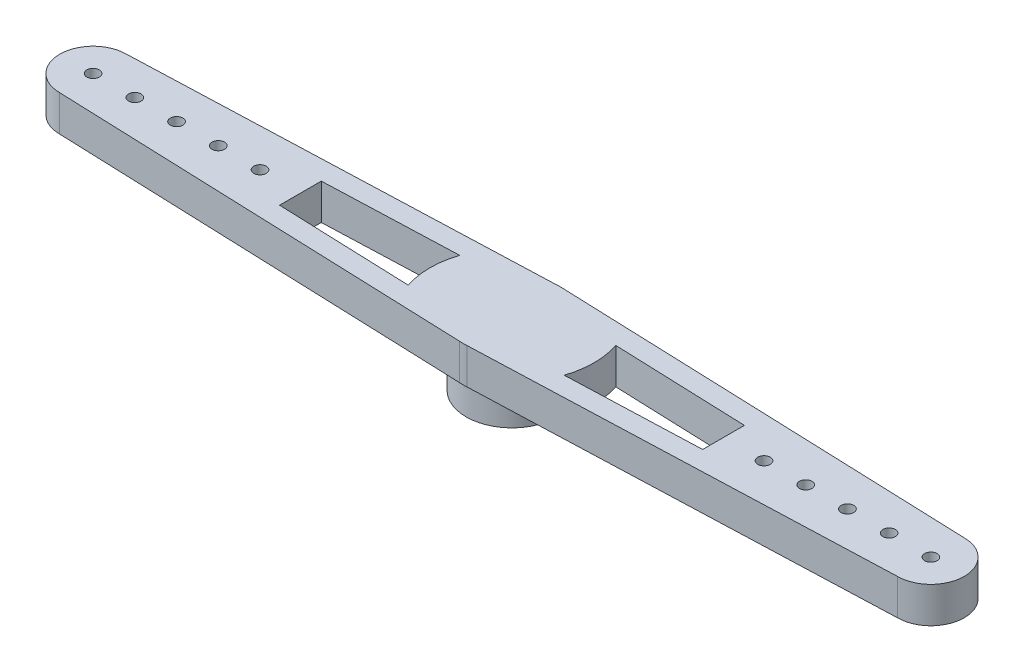
ISO-10303-21;
HEADER;
FILE_DESCRIPTION(('STEP AP214'),'2;1');
FILE_NAME('part.step','',(''),(''),'','','');
FILE_SCHEMA(('AUTOMOTIVE_DESIGN { 1 0 10303 214 1 1 1 1 }'));
ENDSEC;
DATA;
#1=APPLICATION_CONTEXT('core data for automotive mechanical design processes');
#2=APPLICATION_PROTOCOL_DEFINITION('international standard','automotive_design',2000,#1);
#3=PRODUCT_CONTEXT('',#1,'mechanical');
#4=PRODUCT('Part','Part','',(#3));
#5=PRODUCT_RELATED_PRODUCT_CATEGORY('part','',(#4));
#6=PRODUCT_DEFINITION_FORMATION('','',#4);
#7=PRODUCT_DEFINITION_CONTEXT('part definition',#1,'design');
#8=PRODUCT_DEFINITION('design','',#6,#7);
#9=PRODUCT_DEFINITION_SHAPE('','',#8);
#10=(LENGTH_UNIT() NAMED_UNIT(*) SI_UNIT(.MILLI.,.METRE.));
#11=(NAMED_UNIT(*) PLANE_ANGLE_UNIT() SI_UNIT($,.RADIAN.));
#12=(NAMED_UNIT(*) SI_UNIT($,.STERADIAN.) SOLID_ANGLE_UNIT());
#13=UNCERTAINTY_MEASURE_WITH_UNIT(LENGTH_MEASURE(1.E-05),#10,'distance_accuracy_value','');
#14=(GEOMETRIC_REPRESENTATION_CONTEXT(3) GLOBAL_UNCERTAINTY_ASSIGNED_CONTEXT((#13)) GLOBAL_UNIT_ASSIGNED_CONTEXT((#10,
#11,#12)) REPRESENTATION_CONTEXT('',''));
#15=CARTESIAN_POINT('',(0.,0.,0.));
#16=DIRECTION('',(0.,0.,1.));
#17=DIRECTION('',(1.,0.,0.));
#18=AXIS2_PLACEMENT_3D('',#15,#16,#17);
#19=CARTESIAN_POINT('',(0.,0.,0.));
#20=DIRECTION('',(0.,1.,0.));
#21=DIRECTION('',(0.,0.,1.));
#22=AXIS2_PLACEMENT_3D('',#19,#20,#21);
#23=PLANE('',#22);
#24=CARTESIAN_POINT('',(0.,0.,0.));
#25=DIRECTION('',(0.,1.,0.));
#26=DIRECTION('',(0.,0.,1.));
#27=AXIS2_PLACEMENT_3D('',#24,#25,#26);
#28=CIRCLE('',#27,1.95);
#29=CARTESIAN_POINT('',(0.,0.,1.95));
#30=VERTEX_POINT('',#29);
#31=EDGE_CURVE('E20',#30,#30,#28,.F.);
#32=ORIENTED_EDGE('',*,*,#31,.T.);
#33=EDGE_LOOP('',(#32));
#34=FACE_BOUND('',#33,.T.);
#35=ADVANCED_FACE('F17',(#34),#23,.F.);
#36=CARTESIAN_POINT('',(0.,-1.75,0.));
#37=DIRECTION('',(0.,1.,0.));
#38=DIRECTION('',(0.,0.,1.));
#39=AXIS2_PLACEMENT_3D('',#36,#37,#38);
#40=CYLINDRICAL_SURFACE('',#39,1.95);
#41=CARTESIAN_POINT('',(0.,-1.75,0.));
#42=DIRECTION('',(0.,1.,0.));
#43=DIRECTION('',(0.,0.,1.));
#44=AXIS2_PLACEMENT_3D('',#41,#42,#43);
#45=CIRCLE('',#44,1.95);
#46=CARTESIAN_POINT('',(0.,-1.75,1.95));
#47=VERTEX_POINT('',#46);
#48=EDGE_CURVE('E352',#47,#47,#45,.F.);
#49=ORIENTED_EDGE('',*,*,#48,.T.);
#50=EDGE_LOOP('',(#49));
#51=FACE_BOUND('',#50,.T.);
#52=ORIENTED_EDGE('',*,*,#31,.F.);
#53=EDGE_LOOP('',(#52));
#54=FACE_BOUND('',#53,.T.);
#55=ADVANCED_FACE('F360',(#51,#54),#40,.F.);
#56=CARTESIAN_POINT('',(0.,-1.75,0.));
#57=DIRECTION('',(0.,1.,0.));
#58=DIRECTION('',(0.,0.,1.));
#59=AXIS2_PLACEMENT_3D('',#56,#57,#58);
#60=PLANE('',#59);
#61=CARTESIAN_POINT('',(0.,-1.75,0.));
#62=DIRECTION('',(0.,1.,0.));
#63=DIRECTION('',(0.,0.,1.));
#64=AXIS2_PLACEMENT_3D('',#61,#62,#63);
#65=CIRCLE('',#64,2.75);
#66=CARTESIAN_POINT('',(0.,-1.75,2.75));
#67=VERTEX_POINT('',#66);
#68=EDGE_CURVE('E141',#67,#67,#65,.T.);
#69=ORIENTED_EDGE('',*,*,#68,.F.);
#70=EDGE_LOOP('',(#69));
#71=FACE_BOUND('',#70,.T.);
#72=ORIENTED_EDGE('',*,*,#48,.F.);
#73=EDGE_LOOP('',(#72));
#74=FACE_BOUND('',#73,.T.);
#75=ADVANCED_FACE('F362',(#71,#74),#60,.F.);
#76=CARTESIAN_POINT('',(0.,-1.75,0.));
#77=DIRECTION('',(0.,1.,0.));
#78=DIRECTION('',(0.,0.,1.));
#79=AXIS2_PLACEMENT_3D('',#76,#77,#78);
#80=CYLINDRICAL_SURFACE('',#79,2.75);
#81=CARTESIAN_POINT('',(0.,0.,0.));
#82=DIRECTION('',(0.,1.,0.));
#83=DIRECTION('',(0.,0.,1.));
#84=AXIS2_PLACEMENT_3D('',#81,#82,#83);
#85=CIRCLE('',#84,2.75);
#86=CARTESIAN_POINT('',(0.,0.,2.75));
#87=VERTEX_POINT('',#86);
#88=EDGE_CURVE('E347',#87,#87,#85,.F.);
#89=ORIENTED_EDGE('',*,*,#88,.T.);
#90=EDGE_LOOP('',(#89));
#91=FACE_BOUND('',#90,.T.);
#92=ORIENTED_EDGE('',*,*,#68,.T.);
#93=EDGE_LOOP('',(#92));
#94=FACE_BOUND('',#93,.T.);
#95=ADVANCED_FACE('F368',(#91,#94),#80,.T.);
#96=CARTESIAN_POINT('',(0.,2.15,0.));
#97=DIRECTION('',(0.,-1.,0.));
#98=DIRECTION('',(0.,0.,-1.));
#99=AXIS2_PLACEMENT_3D('',#96,#97,#98);
#100=CYLINDRICAL_SURFACE('',#99,2.925);
#101=CARTESIAN_POINT('',(0.,0.,0.));
#102=DIRECTION('',(0.,-1.,0.));
#103=DIRECTION('',(0.,0.,-1.));
#104=AXIS2_PLACEMENT_3D('',#101,#102,#103);
#105=CIRCLE('',#104,2.925);
#106=CARTESIAN_POINT('',(0.215295254040806,0.,-2.91706581235108));
#107=VERTEX_POINT('',#106);
#108=CARTESIAN_POINT('',(-0.215295254040806,0.,-2.91706581235108));
#109=VERTEX_POINT('',#108);
#110=EDGE_CURVE('E345',#107,#109,#105,.F.);
#111=ORIENTED_EDGE('',*,*,#110,.T.);
#112=DIRECTION('',(0.,1.,0.));
#113=VECTOR('',#112,1.);
#114=CARTESIAN_POINT('',(-0.215295254040813,2.15,-2.91706581235108));
#115=LINE('',#114,#113);
#116=CARTESIAN_POINT('',(-0.215295254040802,2.15,-2.91706581235109));
#117=VERTEX_POINT('',#116);
#118=EDGE_CURVE('E138',#109,#117,#115,.T.);
#119=ORIENTED_EDGE('',*,*,#118,.T.);
#120=CARTESIAN_POINT('',(0.,2.15,0.));
#121=DIRECTION('',(0.,-1.,0.));
#122=DIRECTION('',(0.,0.,-1.));
#123=AXIS2_PLACEMENT_3D('',#120,#121,#122);
#124=CIRCLE('',#123,2.925);
#125=CARTESIAN_POINT('',(0.215295254040806,2.15,-2.91706581235108));
#126=VERTEX_POINT('',#125);
#127=EDGE_CURVE('E129',#117,#126,#124,.T.);
#128=ORIENTED_EDGE('',*,*,#127,.T.);
#129=DIRECTION('',(0.,1.,0.));
#130=VECTOR('',#129,1.);
#131=CARTESIAN_POINT('',(0.215295254040813,2.15,-2.91706581235108));
#132=LINE('',#131,#130);
#133=EDGE_CURVE('E135',#126,#107,#132,.F.);
#134=ORIENTED_EDGE('',*,*,#133,.T.);
#135=EDGE_LOOP('',(#111,#119,#128,#134));
#136=FACE_BOUND('',#135,.T.);
#137=ADVANCED_FACE('F134',(#136),#100,.T.);
#138=CARTESIAN_POINT('',(0.,2.15,0.));
#139=DIRECTION('',(0.,-1.,0.));
#140=DIRECTION('',(0.,0.,-1.));
#141=AXIS2_PLACEMENT_3D('',#138,#139,#140);
#142=CYLINDRICAL_SURFACE('',#141,2.925);
#143=DIRECTION('',(0.,1.,0.));
#144=VECTOR('',#143,1.);
#145=CARTESIAN_POINT('',(-0.215295254040813,2.15,2.91706581235108));
#146=LINE('',#145,#144);
#147=CARTESIAN_POINT('',(-0.215295254040806,0.,2.91706581235108));
#148=VERTEX_POINT('',#147);
#149=CARTESIAN_POINT('',(-0.215295254040806,2.15,2.91706581235108));
#150=VERTEX_POINT('',#149);
#151=EDGE_CURVE('E214',#148,#150,#146,.T.);
#152=ORIENTED_EDGE('',*,*,#151,.F.);
#153=CARTESIAN_POINT('',(0.,0.,0.));
#154=DIRECTION('',(0.,-1.,0.));
#155=DIRECTION('',(0.,0.,-1.));
#156=AXIS2_PLACEMENT_3D('',#153,#154,#155);
#157=CIRCLE('',#156,2.925);
#158=CARTESIAN_POINT('',(0.215295254040806,0.,2.91706581235108));
#159=VERTEX_POINT('',#158);
#160=EDGE_CURVE('E343',#148,#159,#157,.F.);
#161=ORIENTED_EDGE('',*,*,#160,.T.);
#162=DIRECTION('',(0.,1.,0.));
#163=VECTOR('',#162,1.);
#164=CARTESIAN_POINT('',(0.215295254040813,2.15,2.91706581235108));
#165=LINE('',#164,#163);
#166=CARTESIAN_POINT('',(0.215295254040806,2.15,2.91706581235108));
#167=VERTEX_POINT('',#166);
#168=EDGE_CURVE('E207',#159,#167,#165,.T.);
#169=ORIENTED_EDGE('',*,*,#168,.T.);
#170=CARTESIAN_POINT('',(0.,2.15,0.));
#171=DIRECTION('',(0.,-1.,0.));
#172=DIRECTION('',(0.,0.,-1.));
#173=AXIS2_PLACEMENT_3D('',#170,#171,#172);
#174=CIRCLE('',#173,2.925);
#175=EDGE_CURVE('E140',#167,#150,#174,.T.);
#176=ORIENTED_EDGE('',*,*,#175,.T.);
#177=EDGE_LOOP('',(#152,#161,#169,#176));
#178=FACE_BOUND('',#177,.T.);
#179=ADVANCED_FACE('F475',(#178),#142,.T.);
#180=CARTESIAN_POINT('',(0.,0.,0.));
#181=DIRECTION('',(0.,1.,0.));
#182=DIRECTION('',(0.,0.,1.));
#183=AXIS2_PLACEMENT_3D('',#180,#181,#182);
#184=PLANE('',#183);
#185=DIRECTION('',(0.999321634213441,0.,-0.0368275901054752));
#186=VECTOR('',#185,1.);
#187=CARTESIAN_POINT('',(0.0631959614652687,0.,1.71483095435487));
#188=LINE('',#187,#186);
#189=CARTESIAN_POINT('',(4.67644672287854,0.,1.54482071713147));
#190=VERTEX_POINT('',#189);
#191=CARTESIAN_POINT('',(12.6764467228785,0.,1.25));
#192=VERTEX_POINT('',#191);
#193=EDGE_CURVE('E194',#190,#192,#188,.T.);
#194=ORIENTED_EDGE('',*,*,#193,.T.);
#195=DIRECTION('',(0.,0.,-1.));
#196=VECTOR('',#195,1.);
#197=CARTESIAN_POINT('',(12.6764467228785,0.,0.));
#198=LINE('',#197,#196);
#199=CARTESIAN_POINT('',(12.6764467228785,0.,-1.25));
#200=VERTEX_POINT('',#199);
#201=EDGE_CURVE('E188',#192,#200,#198,.T.);
#202=ORIENTED_EDGE('',*,*,#201,.T.);
#203=DIRECTION('',(0.999321634213441,0.,0.0368275901054754));
#204=VECTOR('',#203,1.);
#205=CARTESIAN_POINT('',(0.063195961465269,0.,-1.71483095435487));
#206=LINE('',#205,#204);
#207=CARTESIAN_POINT('',(4.67644672287854,0.,-1.54482071713147));
#208=VERTEX_POINT('',#207);
#209=EDGE_CURVE('E181',#208,#200,#206,.T.);
#210=ORIENTED_EDGE('',*,*,#209,.F.);
#211=CARTESIAN_POINT('',(0.,0.,0.));
#212=DIRECTION('',(0.,-1.,0.));
#213=DIRECTION('',(0.,0.,-1.));
#214=AXIS2_PLACEMENT_3D('',#211,#212,#213);
#215=CIRCLE('',#214,4.925);
#216=EDGE_CURVE('E182',#190,#208,#215,.F.);
#217=ORIENTED_EDGE('',*,*,#216,.F.);
#218=EDGE_LOOP('',(#194,#202,#210,#217));
#219=FACE_BOUND('',#218,.T.);
#220=CARTESIAN_POINT('',(22.6,0.,0.));
#221=DIRECTION('',(0.,-1.,0.));
#222=DIRECTION('',(0.,0.,-1.));
#223=AXIS2_PLACEMENT_3D('',#220,#221,#222);
#224=CIRCLE('',#223,0.374999999999999);
#225=CARTESIAN_POINT('',(22.6,0.,-0.374999999999999));
#226=VERTEX_POINT('',#225);
#227=EDGE_CURVE('E340',#226,#226,#224,.F.);
#228=ORIENTED_EDGE('',*,*,#227,.T.);
#229=EDGE_LOOP('',(#228));
#230=FACE_BOUND('',#229,.T.);
#231=CARTESIAN_POINT('',(20.1,0.,0.));
#232=DIRECTION('',(0.,-1.,0.));
#233=DIRECTION('',(0.,0.,-1.));
#234=AXIS2_PLACEMENT_3D('',#231,#232,#233);
#235=CIRCLE('',#234,0.374999999999999);
#236=CARTESIAN_POINT('',(20.1,0.,-0.374999999999999));
#237=VERTEX_POINT('',#236);
#238=EDGE_CURVE('E337',#237,#237,#235,.F.);
#239=ORIENTED_EDGE('',*,*,#238,.T.);
#240=EDGE_LOOP('',(#239));
#241=FACE_BOUND('',#240,.T.);
#242=CARTESIAN_POINT('',(17.6,0.,0.));
#243=DIRECTION('',(0.,-1.,0.));
#244=DIRECTION('',(0.,0.,-1.));
#245=AXIS2_PLACEMENT_3D('',#242,#243,#244);
#246=CIRCLE('',#245,0.374999999999999);
#247=CARTESIAN_POINT('',(17.6,0.,-0.374999999999999));
#248=VERTEX_POINT('',#247);
#249=EDGE_CURVE('E334',#248,#248,#246,.F.);
#250=ORIENTED_EDGE('',*,*,#249,.T.);
#251=EDGE_LOOP('',(#250));
#252=FACE_BOUND('',#251,.T.);
#253=CARTESIAN_POINT('',(15.1,0.,0.));
#254=DIRECTION('',(0.,-1.,0.));
#255=DIRECTION('',(0.,0.,-1.));
#256=AXIS2_PLACEMENT_3D('',#253,#254,#255);
#257=CIRCLE('',#256,0.374999999999999);
#258=CARTESIAN_POINT('',(15.1,0.,-0.374999999999999));
#259=VERTEX_POINT('',#258);
#260=EDGE_CURVE('E331',#259,#259,#257,.F.);
#261=ORIENTED_EDGE('',*,*,#260,.T.);
#262=EDGE_LOOP('',(#261));
#263=FACE_BOUND('',#262,.T.);
#264=CARTESIAN_POINT('',(25.1,0.,0.));
#265=DIRECTION('',(0.,-1.,0.));
#266=DIRECTION('',(0.,0.,-1.));
#267=AXIS2_PLACEMENT_3D('',#264,#265,#266);
#268=CIRCLE('',#267,0.374999999999999);
#269=CARTESIAN_POINT('',(25.1,0.,-0.374999999999999));
#270=VERTEX_POINT('',#269);
#271=EDGE_CURVE('E328',#270,#270,#268,.F.);
#272=ORIENTED_EDGE('',*,*,#271,.T.);
#273=EDGE_LOOP('',(#272));
#274=FACE_BOUND('',#273,.T.);
#275=CARTESIAN_POINT('',(0.,0.,0.));
#276=DIRECTION('',(0.,-1.,0.));
#277=DIRECTION('',(0.,0.,-1.));
#278=AXIS2_PLACEMENT_3D('',#275,#276,#277);
#279=CIRCLE('',#278,4.925);
#280=CARTESIAN_POINT('',(-4.67644672287854,0.,-1.54482071713147));
#281=VERTEX_POINT('',#280);
#282=CARTESIAN_POINT('',(-4.67644672287854,0.,1.54482071713147));
#283=VERTEX_POINT('',#282);
#284=EDGE_CURVE('E246',#281,#283,#279,.F.);
#285=ORIENTED_EDGE('',*,*,#284,.F.);
#286=DIRECTION('',(-0.999321634213441,0.,0.0368275901054754));
#287=VECTOR('',#286,1.);
#288=CARTESIAN_POINT('',(-0.063195961465269,0.,-1.71483095435487));
#289=LINE('',#288,#287);
#290=CARTESIAN_POINT('',(-12.6764467228785,0.,-1.25));
#291=VERTEX_POINT('',#290);
#292=EDGE_CURVE('E226',#281,#291,#289,.T.);
#293=ORIENTED_EDGE('',*,*,#292,.T.);
#294=DIRECTION('',(0.,0.,-1.));
#295=VECTOR('',#294,1.);
#296=CARTESIAN_POINT('',(-12.6764467228785,0.,0.));
#297=LINE('',#296,#295);
#298=CARTESIAN_POINT('',(-12.6764467228785,0.,1.25));
#299=VERTEX_POINT('',#298);
#300=EDGE_CURVE('E227',#299,#291,#297,.T.);
#301=ORIENTED_EDGE('',*,*,#300,.F.);
#302=DIRECTION('',(-0.999321634213441,0.,-0.0368275901054752));
#303=VECTOR('',#302,1.);
#304=CARTESIAN_POINT('',(-0.0631959614652687,0.,1.71483095435487));
#305=LINE('',#304,#303);
#306=EDGE_CURVE('E240',#283,#299,#305,.T.);
#307=ORIENTED_EDGE('',*,*,#306,.F.);
#308=EDGE_LOOP('',(#285,#293,#301,#307));
#309=FACE_BOUND('',#308,.T.);
#310=CARTESIAN_POINT('',(-22.6,0.,0.));
#311=DIRECTION('',(0.,-1.,0.));
#312=DIRECTION('',(0.,0.,-1.));
#313=AXIS2_PLACEMENT_3D('',#310,#311,#312);
#314=CIRCLE('',#313,0.374999999999999);
#315=CARTESIAN_POINT('',(-22.6,0.,-0.374999999999999));
#316=VERTEX_POINT('',#315);
#317=EDGE_CURVE('E230',#316,#316,#314,.F.);
#318=ORIENTED_EDGE('',*,*,#317,.T.);
#319=EDGE_LOOP('',(#318));
#320=FACE_BOUND('',#319,.T.);
#321=CARTESIAN_POINT('',(-25.1,0.,0.));
#322=DIRECTION('',(0.,-1.,0.));
#323=DIRECTION('',(0.,0.,-1.));
#324=AXIS2_PLACEMENT_3D('',#321,#322,#323);
#325=CIRCLE('',#324,0.374999999999999);
#326=CARTESIAN_POINT('',(-25.1,0.,-0.374999999999999));
#327=VERTEX_POINT('',#326);
#328=EDGE_CURVE('E260',#327,#327,#325,.F.);
#329=ORIENTED_EDGE('',*,*,#328,.T.);
#330=EDGE_LOOP('',(#329));
#331=FACE_BOUND('',#330,.T.);
#332=ORIENTED_EDGE('',*,*,#160,.F.);
#333=DIRECTION('',(0.999321634213441,0.,0.0368275901054752));
#334=VECTOR('',#333,1.);
#335=CARTESIAN_POINT('',(-0.107647627020413,0.,2.92103290617554));
#336=LINE('',#335,#334);
#337=CARTESIAN_POINT('',(-25.1,0.,2.));
#338=VERTEX_POINT('',#337);
#339=EDGE_CURVE('E217',#338,#148,#336,.T.);
#340=ORIENTED_EDGE('',*,*,#339,.F.);
#341=CARTESIAN_POINT('',(-25.1,0.,0.));
#342=DIRECTION('',(0.,-1.,0.));
#343=DIRECTION('',(0.,0.,-1.));
#344=AXIS2_PLACEMENT_3D('',#341,#342,#343);
#345=CIRCLE('',#344,2.);
#346=CARTESIAN_POINT('',(-25.1,0.,-2.));
#347=VERTEX_POINT('',#346);
#348=EDGE_CURVE('E221',#347,#338,#345,.F.);
#349=ORIENTED_EDGE('',*,*,#348,.F.);
#350=DIRECTION('',(0.999321634213441,0.,-0.0368275901054752));
#351=VECTOR('',#350,1.);
#352=CARTESIAN_POINT('',(-0.107647627020413,0.,-2.92103290617554));
#353=LINE('',#352,#351);
#354=EDGE_CURVE('E149',#347,#109,#353,.T.);
#355=ORIENTED_EDGE('',*,*,#354,.T.);
#356=ORIENTED_EDGE('',*,*,#110,.F.);
#357=DIRECTION('',(0.999321634213441,0.,0.0368275901054752));
#358=VECTOR('',#357,1.);
#359=CARTESIAN_POINT('',(0.107647627020413,0.,-2.92103290617554));
#360=LINE('',#359,#358);
#361=CARTESIAN_POINT('',(25.1,0.,-2.));
#362=VERTEX_POINT('',#361);
#363=EDGE_CURVE('E148',#107,#362,#360,.T.);
#364=ORIENTED_EDGE('',*,*,#363,.T.);
#365=CARTESIAN_POINT('',(25.1,0.,0.));
#366=DIRECTION('',(0.,-1.,0.));
#367=DIRECTION('',(0.,0.,-1.));
#368=AXIS2_PLACEMENT_3D('',#365,#366,#367);
#369=CIRCLE('',#368,2.);
#370=CARTESIAN_POINT('',(25.1,0.,2.));
#371=VERTEX_POINT('',#370);
#372=EDGE_CURVE('E203',#371,#362,#369,.F.);
#373=ORIENTED_EDGE('',*,*,#372,.F.);
#374=DIRECTION('',(-0.999321634213441,0.,0.0368275901054752));
#375=VECTOR('',#374,1.);
#376=CARTESIAN_POINT('',(0.107647627020413,0.,2.92103290617554));
#377=LINE('',#376,#375);
#378=EDGE_CURVE('E210',#371,#159,#377,.T.);
#379=ORIENTED_EDGE('',*,*,#378,.T.);
#380=EDGE_LOOP('',(#332,#340,#349,#355,#356,#364,#373,#379));
#381=FACE_BOUND('',#380,.T.);
#382=CARTESIAN_POINT('',(-20.1,0.,0.));
#383=DIRECTION('',(0.,-1.,0.));
#384=DIRECTION('',(0.,0.,-1.));
#385=AXIS2_PLACEMENT_3D('',#382,#383,#384);
#386=CIRCLE('',#385,0.374999999999999);
#387=CARTESIAN_POINT('',(-20.1,0.,-0.374999999999999));
#388=VERTEX_POINT('',#387);
#389=EDGE_CURVE('E206',#388,#388,#386,.F.);
#390=ORIENTED_EDGE('',*,*,#389,.T.);
#391=EDGE_LOOP('',(#390));
#392=FACE_BOUND('',#391,.T.);
#393=CARTESIAN_POINT('',(-17.6,0.,0.));
#394=DIRECTION('',(0.,-1.,0.));
#395=DIRECTION('',(0.,0.,-1.));
#396=AXIS2_PLACEMENT_3D('',#393,#394,#395);
#397=CIRCLE('',#396,0.374999999999999);
#398=CARTESIAN_POINT('',(-17.6,0.,-0.374999999999999));
#399=VERTEX_POINT('',#398);
#400=EDGE_CURVE('E314',#399,#399,#397,.F.);
#401=ORIENTED_EDGE('',*,*,#400,.T.);
#402=EDGE_LOOP('',(#401));
#403=FACE_BOUND('',#402,.T.);
#404=CARTESIAN_POINT('',(-15.1,0.,0.));
#405=DIRECTION('',(0.,-1.,0.));
#406=DIRECTION('',(0.,0.,-1.));
#407=AXIS2_PLACEMENT_3D('',#404,#405,#406);
#408=CIRCLE('',#407,0.374999999999999);
#409=CARTESIAN_POINT('',(-15.1,0.,-0.374999999999999));
#410=VERTEX_POINT('',#409);
#411=EDGE_CURVE('E254',#410,#410,#408,.F.);
#412=ORIENTED_EDGE('',*,*,#411,.T.);
#413=EDGE_LOOP('',(#412));
#414=FACE_BOUND('',#413,.T.);
#415=ORIENTED_EDGE('',*,*,#88,.F.);
#416=EDGE_LOOP('',(#415));
#417=FACE_BOUND('',#416,.T.);
#418=ADVANCED_FACE('F471',(#219,#230,#241,#252,#263,#274,#309,#320,#331,#381,#392,#403,#414,
#417),#184,.F.);
#419=CARTESIAN_POINT('',(22.6,2.16480476848279,0.));
#420=DIRECTION('',(0.,-1.,0.));
#421=DIRECTION('',(0.,0.,-1.));
#422=AXIS2_PLACEMENT_3D('',#419,#420,#421);
#423=CYLINDRICAL_SURFACE('',#422,0.374999999999999);
#424=CARTESIAN_POINT('',(22.6,2.15,0.));
#425=DIRECTION('',(0.,-1.,0.));
#426=DIRECTION('',(0.,0.,-1.));
#427=AXIS2_PLACEMENT_3D('',#424,#425,#426);
#428=CIRCLE('',#427,0.374999999999999);
#429=CARTESIAN_POINT('',(22.6,2.15,-0.374999999999999));
#430=VERTEX_POINT('',#429);
#431=EDGE_CURVE('E187',#430,#430,#428,.T.);
#432=ORIENTED_EDGE('',*,*,#431,.F.);
#433=EDGE_LOOP('',(#432));
#434=FACE_BOUND('',#433,.T.);
#435=ORIENTED_EDGE('',*,*,#227,.F.);
#436=EDGE_LOOP('',(#435));
#437=FACE_BOUND('',#436,.T.);
#438=ADVANCED_FACE('F467',(#434,#437),#423,.F.);
#439=CARTESIAN_POINT('',(20.1,2.16480476848279,0.));
#440=DIRECTION('',(0.,-1.,0.));
#441=DIRECTION('',(0.,0.,-1.));
#442=AXIS2_PLACEMENT_3D('',#439,#440,#441);
#443=CYLINDRICAL_SURFACE('',#442,0.374999999999999);
#444=CARTESIAN_POINT('',(20.1,2.15,0.));
#445=DIRECTION('',(0.,-1.,0.));
#446=DIRECTION('',(0.,0.,-1.));
#447=AXIS2_PLACEMENT_3D('',#444,#445,#446);
#448=CIRCLE('',#447,0.374999999999999);
#449=CARTESIAN_POINT('',(20.1,2.15,-0.374999999999999));
#450=VERTEX_POINT('',#449);
#451=EDGE_CURVE('E306',#450,#450,#448,.T.);
#452=ORIENTED_EDGE('',*,*,#451,.F.);
#453=EDGE_LOOP('',(#452));
#454=FACE_BOUND('',#453,.T.);
#455=ORIENTED_EDGE('',*,*,#238,.F.);
#456=EDGE_LOOP('',(#455));
#457=FACE_BOUND('',#456,.T.);
#458=ADVANCED_FACE('F463',(#454,#457),#443,.F.);
#459=CARTESIAN_POINT('',(17.6,2.16480476848279,0.));
#460=DIRECTION('',(0.,-1.,0.));
#461=DIRECTION('',(0.,0.,-1.));
#462=AXIS2_PLACEMENT_3D('',#459,#460,#461);
#463=CYLINDRICAL_SURFACE('',#462,0.374999999999999);
#464=CARTESIAN_POINT('',(17.6,2.15,0.));
#465=DIRECTION('',(0.,-1.,0.));
#466=DIRECTION('',(0.,0.,-1.));
#467=AXIS2_PLACEMENT_3D('',#464,#465,#466);
#468=CIRCLE('',#467,0.374999999999999);
#469=CARTESIAN_POINT('',(17.6,2.15,-0.374999999999999));
#470=VERTEX_POINT('',#469);
#471=EDGE_CURVE('E303',#470,#470,#468,.T.);
#472=ORIENTED_EDGE('',*,*,#471,.F.);
#473=EDGE_LOOP('',(#472));
#474=FACE_BOUND('',#473,.T.);
#475=ORIENTED_EDGE('',*,*,#249,.F.);
#476=EDGE_LOOP('',(#475));
#477=FACE_BOUND('',#476,.T.);
#478=ADVANCED_FACE('F459',(#474,#477),#463,.F.);
#479=CARTESIAN_POINT('',(15.1,2.16480476848279,0.));
#480=DIRECTION('',(0.,-1.,0.));
#481=DIRECTION('',(0.,0.,-1.));
#482=AXIS2_PLACEMENT_3D('',#479,#480,#481);
#483=CYLINDRICAL_SURFACE('',#482,0.374999999999999);
#484=CARTESIAN_POINT('',(15.1,2.15,0.));
#485=DIRECTION('',(0.,-1.,0.));
#486=DIRECTION('',(0.,0.,-1.));
#487=AXIS2_PLACEMENT_3D('',#484,#485,#486);
#488=CIRCLE('',#487,0.374999999999999);
#489=CARTESIAN_POINT('',(15.1,2.15,-0.374999999999999));
#490=VERTEX_POINT('',#489);
#491=EDGE_CURVE('E300',#490,#490,#488,.T.);
#492=ORIENTED_EDGE('',*,*,#491,.F.);
#493=EDGE_LOOP('',(#492));
#494=FACE_BOUND('',#493,.T.);
#495=ORIENTED_EDGE('',*,*,#260,.F.);
#496=EDGE_LOOP('',(#495));
#497=FACE_BOUND('',#496,.T.);
#498=ADVANCED_FACE('F455',(#494,#497),#483,.F.);
#499=CARTESIAN_POINT('',(25.1,2.16480476848279,0.));
#500=DIRECTION('',(0.,-1.,0.));
#501=DIRECTION('',(0.,0.,-1.));
#502=AXIS2_PLACEMENT_3D('',#499,#500,#501);
#503=CYLINDRICAL_SURFACE('',#502,0.374999999999999);
#504=CARTESIAN_POINT('',(25.1,2.15,0.));
#505=DIRECTION('',(0.,-1.,0.));
#506=DIRECTION('',(0.,0.,-1.));
#507=AXIS2_PLACEMENT_3D('',#504,#505,#506);
#508=CIRCLE('',#507,0.374999999999999);
#509=CARTESIAN_POINT('',(25.1,2.15,-0.374999999999999));
#510=VERTEX_POINT('',#509);
#511=EDGE_CURVE('E297',#510,#510,#508,.T.);
#512=ORIENTED_EDGE('',*,*,#511,.F.);
#513=EDGE_LOOP('',(#512));
#514=FACE_BOUND('',#513,.T.);
#515=ORIENTED_EDGE('',*,*,#271,.F.);
#516=EDGE_LOOP('',(#515));
#517=FACE_BOUND('',#516,.T.);
#518=ADVANCED_FACE('F451',(#514,#517),#503,.F.);
#519=CARTESIAN_POINT('',(0.,2.16480476848279,0.));
#520=DIRECTION('',(0.,-1.,0.));
#521=DIRECTION('',(0.,0.,-1.));
#522=AXIS2_PLACEMENT_3D('',#519,#520,#521);
#523=CYLINDRICAL_SURFACE('',#522,4.925);
#524=ORIENTED_EDGE('',*,*,#284,.T.);
#525=DIRECTION('',(0.,1.,0.));
#526=VECTOR('',#525,1.);
#527=CARTESIAN_POINT('',(-4.67644672287854,2.16480476848279,1.54482071713147));
#528=LINE('',#527,#526);
#529=CARTESIAN_POINT('',(-4.67644672287854,2.15,1.54482071713147));
#530=VERTEX_POINT('',#529);
#531=EDGE_CURVE('E243',#530,#283,#528,.F.);
#532=ORIENTED_EDGE('',*,*,#531,.F.);
#533=CARTESIAN_POINT('',(0.,2.15,0.));
#534=DIRECTION('',(0.,-1.,0.));
#535=DIRECTION('',(0.,0.,-1.));
#536=AXIS2_PLACEMENT_3D('',#533,#534,#535);
#537=CIRCLE('',#536,4.925);
#538=CARTESIAN_POINT('',(-4.67644672287854,2.15,-1.54482071713147));
#539=VERTEX_POINT('',#538);
#540=EDGE_CURVE('E176',#539,#530,#537,.F.);
#541=ORIENTED_EDGE('',*,*,#540,.F.);
#542=DIRECTION('',(0.,1.,0.));
#543=VECTOR('',#542,1.);
#544=CARTESIAN_POINT('',(-4.67644672287854,2.16480476848279,-1.54482071713147));
#545=LINE('',#544,#543);
#546=EDGE_CURVE('E223',#539,#281,#545,.F.);
#547=ORIENTED_EDGE('',*,*,#546,.T.);
#548=EDGE_LOOP('',(#524,#532,#541,#547));
#549=FACE_BOUND('',#548,.T.);
#550=ADVANCED_FACE('F447',(#549),#523,.T.);
#551=CARTESIAN_POINT('',(-0.0631959614652687,2.16480476848279,1.71483095435487));
#552=DIRECTION('',(0.0368275901054752,0.,-0.999321634213441));
#553=DIRECTION('',(-0.999321634213441,0.,-0.0368275901054752));
#554=AXIS2_PLACEMENT_3D('',#551,#552,#553);
#555=PLANE('',#554);
#556=DIRECTION('',(0.,1.,0.));
#557=VECTOR('',#556,1.);
#558=CARTESIAN_POINT('',(-12.6764467228785,2.16480476848279,1.25));
#559=LINE('',#558,#557);
#560=CARTESIAN_POINT('',(-12.6764467228785,2.15,1.25));
#561=VERTEX_POINT('',#560);
#562=EDGE_CURVE('E237',#561,#299,#559,.F.);
#563=ORIENTED_EDGE('',*,*,#562,.F.);
#564=DIRECTION('',(-0.999321634213442,0.,-0.0368275901054751));
#565=VECTOR('',#564,1.);
#566=CARTESIAN_POINT('',(-4.67644672287854,2.15,1.54482071713147));
#567=LINE('',#566,#565);
#568=EDGE_CURVE('E173',#530,#561,#567,.T.);
#569=ORIENTED_EDGE('',*,*,#568,.F.);
#570=ORIENTED_EDGE('',*,*,#531,.T.);
#571=ORIENTED_EDGE('',*,*,#306,.T.);
#572=EDGE_LOOP('',(#563,#569,#570,#571));
#573=FACE_BOUND('',#572,.T.);
#574=ADVANCED_FACE('F443',(#573),#555,.T.);
#575=CARTESIAN_POINT('',(-12.6764467228785,2.16480476848279,0.));
#576=DIRECTION('',(1.,0.,0.));
#577=DIRECTION('',(0.,0.,-1.));
#578=AXIS2_PLACEMENT_3D('',#575,#576,#577);
#579=PLANE('',#578);
#580=DIRECTION('',(0.,1.,0.));
#581=VECTOR('',#580,1.);
#582=CARTESIAN_POINT('',(-12.6764467228785,2.16480476848279,-1.25));
#583=LINE('',#582,#581);
#584=CARTESIAN_POINT('',(-12.6764467228785,2.15,-1.25));
#585=VERTEX_POINT('',#584);
#586=EDGE_CURVE('E228',#291,#585,#583,.T.);
#587=ORIENTED_EDGE('',*,*,#586,.T.);
#588=DIRECTION('',(0.,0.,1.));
#589=VECTOR('',#588,1.);
#590=CARTESIAN_POINT('',(-12.6764467228785,2.15,0.));
#591=LINE('',#590,#589);
#592=EDGE_CURVE('E170',#561,#585,#591,.F.);
#593=ORIENTED_EDGE('',*,*,#592,.F.);
#594=ORIENTED_EDGE('',*,*,#562,.T.);
#595=ORIENTED_EDGE('',*,*,#300,.T.);
#596=EDGE_LOOP('',(#587,#593,#594,#595));
#597=FACE_BOUND('',#596,.T.);
#598=ADVANCED_FACE('F439',(#597),#579,.T.);
#599=CARTESIAN_POINT('',(-0.063195961465269,2.16480476848279,-1.71483095435487));
#600=DIRECTION('',(-0.0368275901054754,0.,-0.999321634213441));
#601=DIRECTION('',(-0.999321634213441,0.,0.0368275901054754));
#602=AXIS2_PLACEMENT_3D('',#599,#600,#601);
#603=PLANE('',#602);
#604=ORIENTED_EDGE('',*,*,#586,.F.);
#605=ORIENTED_EDGE('',*,*,#292,.F.);
#606=ORIENTED_EDGE('',*,*,#546,.F.);
#607=DIRECTION('',(0.999321634213441,0.,-0.0368275901054754));
#608=VECTOR('',#607,1.);
#609=CARTESIAN_POINT('',(-12.6764467228785,2.15,-1.25));
#610=LINE('',#609,#608);
#611=EDGE_CURVE('E167',#585,#539,#610,.T.);
#612=ORIENTED_EDGE('',*,*,#611,.F.);
#613=EDGE_LOOP('',(#604,#605,#606,#612));
#614=FACE_BOUND('',#613,.T.);
#615=ADVANCED_FACE('F435',(#614),#603,.F.);
#616=CARTESIAN_POINT('',(-22.6,2.16480476848279,0.));
#617=DIRECTION('',(0.,-1.,0.));
#618=DIRECTION('',(0.,0.,-1.));
#619=AXIS2_PLACEMENT_3D('',#616,#617,#618);
#620=CYLINDRICAL_SURFACE('',#619,0.374999999999999);
#621=ORIENTED_EDGE('',*,*,#317,.F.);
#622=EDGE_LOOP('',(#621));
#623=FACE_BOUND('',#622,.T.);
#624=CARTESIAN_POINT('',(-22.6,2.15,0.));
#625=DIRECTION('',(0.,-1.,0.));
#626=DIRECTION('',(0.,0.,-1.));
#627=AXIS2_PLACEMENT_3D('',#624,#625,#626);
#628=CIRCLE('',#627,0.374999999999999);
#629=CARTESIAN_POINT('',(-22.6,2.15,-0.374999999999999));
#630=VERTEX_POINT('',#629);
#631=EDGE_CURVE('E163',#630,#630,#628,.T.);
#632=ORIENTED_EDGE('',*,*,#631,.F.);
#633=EDGE_LOOP('',(#632));
#634=FACE_BOUND('',#633,.T.);
#635=ADVANCED_FACE('F431',(#623,#634),#620,.F.);
#636=CARTESIAN_POINT('',(-25.1,2.16480476848279,0.));
#637=DIRECTION('',(0.,-1.,0.));
#638=DIRECTION('',(0.,0.,-1.));
#639=AXIS2_PLACEMENT_3D('',#636,#637,#638);
#640=CYLINDRICAL_SURFACE('',#639,0.374999999999999);
#641=ORIENTED_EDGE('',*,*,#328,.F.);
#642=EDGE_LOOP('',(#641));
#643=FACE_BOUND('',#642,.T.);
#644=CARTESIAN_POINT('',(-25.1,2.15,0.));
#645=DIRECTION('',(0.,-1.,0.));
#646=DIRECTION('',(0.,0.,-1.));
#647=AXIS2_PLACEMENT_3D('',#644,#645,#646);
#648=CIRCLE('',#647,0.374999999999999);
#649=CARTESIAN_POINT('',(-25.1,2.15,-0.374999999999999));
#650=VERTEX_POINT('',#649);
#651=EDGE_CURVE('E158',#650,#650,#648,.T.);
#652=ORIENTED_EDGE('',*,*,#651,.F.);
#653=EDGE_LOOP('',(#652));
#654=FACE_BOUND('',#653,.T.);
#655=ADVANCED_FACE('F428',(#643,#654),#640,.F.);
#656=CARTESIAN_POINT('',(0.107647627020413,2.15,-2.92103290617554));
#657=DIRECTION('',(-0.0368275901054752,0.,0.999321634213441));
#658=DIRECTION('',(0.999321634213441,0.,0.0368275901054752));
#659=AXIS2_PLACEMENT_3D('',#656,#657,#658);
#660=PLANE('',#659);
#661=DIRECTION('',(-0.999321634213441,0.,-0.0368275901054753));
#662=VECTOR('',#661,1.);
#663=CARTESIAN_POINT('',(25.1,2.15,-2.));
#664=LINE('',#663,#662);
#665=CARTESIAN_POINT('',(25.1,2.15,-2.));
#666=VERTEX_POINT('',#665);
#667=EDGE_CURVE('E146',#666,#126,#664,.T.);
#668=ORIENTED_EDGE('',*,*,#667,.F.);
#669=DIRECTION('',(0.,-1.,0.));
#670=VECTOR('',#669,1.);
#671=CARTESIAN_POINT('',(25.1,2.15,-2.));
#672=LINE('',#671,#670);
#673=EDGE_CURVE('E200',#362,#666,#672,.F.);
#674=ORIENTED_EDGE('',*,*,#673,.F.);
#675=ORIENTED_EDGE('',*,*,#363,.F.);
#676=ORIENTED_EDGE('',*,*,#133,.F.);
#677=EDGE_LOOP('',(#668,#674,#675,#676));
#678=FACE_BOUND('',#677,.T.);
#679=ADVANCED_FACE('F144',(#678),#660,.F.);
#680=CARTESIAN_POINT('',(-0.107647627020413,2.15,-2.92103290617554));
#681=DIRECTION('',(0.0368275901054752,0.,0.999321634213441));
#682=DIRECTION('',(0.999321634213441,0.,-0.0368275901054752));
#683=AXIS2_PLACEMENT_3D('',#680,#681,#682);
#684=PLANE('',#683);
#685=ORIENTED_EDGE('',*,*,#354,.F.);
#686=DIRECTION('',(0.,-1.,0.));
#687=VECTOR('',#686,1.);
#688=CARTESIAN_POINT('',(-25.1,2.15,-2.));
#689=LINE('',#688,#687);
#690=CARTESIAN_POINT('',(-25.1,2.15,-2.));
#691=VERTEX_POINT('',#690);
#692=EDGE_CURVE('E218',#691,#347,#689,.T.);
#693=ORIENTED_EDGE('',*,*,#692,.F.);
#694=DIRECTION('',(-0.999321634213441,0.,0.0368275901054753));
#695=VECTOR('',#694,1.);
#696=CARTESIAN_POINT('',(-0.215295254040813,2.15,-2.91706581235108));
#697=LINE('',#696,#695);
#698=EDGE_CURVE('E157',#117,#691,#697,.T.);
#699=ORIENTED_EDGE('',*,*,#698,.F.);
#700=ORIENTED_EDGE('',*,*,#118,.F.);
#701=EDGE_LOOP('',(#685,#693,#699,#700));
#702=FACE_BOUND('',#701,.T.);
#703=ADVANCED_FACE('F421',(#702),#684,.F.);
#704=CARTESIAN_POINT('',(-25.1,2.15,0.));
#705=DIRECTION('',(0.,-1.,0.));
#706=DIRECTION('',(0.,0.,-1.));
#707=AXIS2_PLACEMENT_3D('',#704,#705,#706);
#708=CYLINDRICAL_SURFACE('',#707,2.);
#709=CARTESIAN_POINT('',(-25.1,2.15,0.));
#710=DIRECTION('',(0.,-1.,0.));
#711=DIRECTION('',(0.,0.,-1.));
#712=AXIS2_PLACEMENT_3D('',#709,#710,#711);
#713=CIRCLE('',#712,2.);
#714=CARTESIAN_POINT('',(-25.1,2.15,2.));
#715=VERTEX_POINT('',#714);
#716=EDGE_CURVE('E160',#691,#715,#713,.F.);
#717=ORIENTED_EDGE('',*,*,#716,.F.);
#718=ORIENTED_EDGE('',*,*,#692,.T.);
#719=ORIENTED_EDGE('',*,*,#348,.T.);
#720=DIRECTION('',(0.,1.,0.));
#721=VECTOR('',#720,1.);
#722=CARTESIAN_POINT('',(-25.1,2.15,2.));
#723=LINE('',#722,#721);
#724=EDGE_CURVE('E211',#715,#338,#723,.F.);
#725=ORIENTED_EDGE('',*,*,#724,.F.);
#726=EDGE_LOOP('',(#717,#718,#719,#725));
#727=FACE_BOUND('',#726,.T.);
#728=ADVANCED_FACE('F417',(#727),#708,.T.);
#729=CARTESIAN_POINT('',(-0.107647627020413,2.15,2.92103290617554));
#730=DIRECTION('',(-0.0368275901054752,0.,0.999321634213441));
#731=DIRECTION('',(0.999321634213441,0.,0.0368275901054752));
#732=AXIS2_PLACEMENT_3D('',#729,#730,#731);
#733=PLANE('',#732);
#734=DIRECTION('',(0.999321634213441,0.,0.0368275901054753));
#735=VECTOR('',#734,1.);
#736=CARTESIAN_POINT('',(-25.1,2.15,2.));
#737=LINE('',#736,#735);
#738=EDGE_CURVE('E291',#715,#150,#737,.T.);
#739=ORIENTED_EDGE('',*,*,#738,.F.);
#740=ORIENTED_EDGE('',*,*,#724,.T.);
#741=ORIENTED_EDGE('',*,*,#339,.T.);
#742=ORIENTED_EDGE('',*,*,#151,.T.);
#743=EDGE_LOOP('',(#739,#740,#741,#742));
#744=FACE_BOUND('',#743,.T.);
#745=ADVANCED_FACE('F413',(#744),#733,.T.);
#746=CARTESIAN_POINT('',(0.107647627020413,2.15,2.92103290617554));
#747=DIRECTION('',(-0.0368275901054752,0.,-0.999321634213441));
#748=DIRECTION('',(-0.999321634213441,0.,0.0368275901054752));
#749=AXIS2_PLACEMENT_3D('',#746,#747,#748);
#750=PLANE('',#749);
#751=ORIENTED_EDGE('',*,*,#378,.F.);
#752=DIRECTION('',(0.,-1.,0.));
#753=VECTOR('',#752,1.);
#754=CARTESIAN_POINT('',(25.1,2.15,2.));
#755=LINE('',#754,#753);
#756=CARTESIAN_POINT('',(25.1,2.15,2.));
#757=VERTEX_POINT('',#756);
#758=EDGE_CURVE('E202',#757,#371,#755,.T.);
#759=ORIENTED_EDGE('',*,*,#758,.F.);
#760=DIRECTION('',(0.999321634213441,0.,-0.0368275901054753));
#761=VECTOR('',#760,1.);
#762=CARTESIAN_POINT('',(0.215295254040813,2.15,2.91706581235108));
#763=LINE('',#762,#761);
#764=EDGE_CURVE('E289',#167,#757,#763,.T.);
#765=ORIENTED_EDGE('',*,*,#764,.F.);
#766=ORIENTED_EDGE('',*,*,#168,.F.);
#767=EDGE_LOOP('',(#751,#759,#765,#766));
#768=FACE_BOUND('',#767,.T.);
#769=ADVANCED_FACE('F409',(#768),#750,.F.);
#770=CARTESIAN_POINT('',(25.1,2.15,0.));
#771=DIRECTION('',(0.,-1.,0.));
#772=DIRECTION('',(0.,0.,-1.));
#773=AXIS2_PLACEMENT_3D('',#770,#771,#772);
#774=CYLINDRICAL_SURFACE('',#773,2.);
#775=CARTESIAN_POINT('',(25.1,2.15,0.));
#776=DIRECTION('',(0.,-1.,0.));
#777=DIRECTION('',(0.,0.,-1.));
#778=AXIS2_PLACEMENT_3D('',#775,#776,#777);
#779=CIRCLE('',#778,2.);
#780=EDGE_CURVE('E156',#757,#666,#779,.F.);
#781=ORIENTED_EDGE('',*,*,#780,.F.);
#782=ORIENTED_EDGE('',*,*,#758,.T.);
#783=ORIENTED_EDGE('',*,*,#372,.T.);
#784=ORIENTED_EDGE('',*,*,#673,.T.);
#785=EDGE_LOOP('',(#781,#782,#783,#784));
#786=FACE_BOUND('',#785,.T.);
#787=ADVANCED_FACE('F405',(#786),#774,.T.);
#788=CARTESIAN_POINT('',(-20.1,2.16480476848279,0.));
#789=DIRECTION('',(0.,-1.,0.));
#790=DIRECTION('',(0.,0.,-1.));
#791=AXIS2_PLACEMENT_3D('',#788,#789,#790);
#792=CYLINDRICAL_SURFACE('',#791,0.374999999999999);
#793=ORIENTED_EDGE('',*,*,#389,.F.);
#794=EDGE_LOOP('',(#793));
#795=FACE_BOUND('',#794,.T.);
#796=CARTESIAN_POINT('',(-20.1,2.15,0.));
#797=DIRECTION('',(0.,-1.,0.));
#798=DIRECTION('',(0.,0.,-1.));
#799=AXIS2_PLACEMENT_3D('',#796,#797,#798);
#800=CIRCLE('',#799,0.374999999999999);
#801=CARTESIAN_POINT('',(-20.1,2.15,-0.374999999999999));
#802=VERTEX_POINT('',#801);
#803=EDGE_CURVE('E285',#802,#802,#800,.T.);
#804=ORIENTED_EDGE('',*,*,#803,.F.);
#805=EDGE_LOOP('',(#804));
#806=FACE_BOUND('',#805,.T.);
#807=ADVANCED_FACE('F401',(#795,#806),#792,.F.);
#808=CARTESIAN_POINT('',(-17.6,2.16480476848279,0.));
#809=DIRECTION('',(0.,-1.,0.));
#810=DIRECTION('',(0.,0.,-1.));
#811=AXIS2_PLACEMENT_3D('',#808,#809,#810);
#812=CYLINDRICAL_SURFACE('',#811,0.374999999999999);
#813=ORIENTED_EDGE('',*,*,#400,.F.);
#814=EDGE_LOOP('',(#813));
#815=FACE_BOUND('',#814,.T.);
#816=CARTESIAN_POINT('',(-17.6,2.15,0.));
#817=DIRECTION('',(0.,-1.,0.));
#818=DIRECTION('',(0.,0.,-1.));
#819=AXIS2_PLACEMENT_3D('',#816,#817,#818);
#820=CIRCLE('',#819,0.374999999999999);
#821=CARTESIAN_POINT('',(-17.6,2.15,-0.374999999999999));
#822=VERTEX_POINT('',#821);
#823=EDGE_CURVE('E282',#822,#822,#820,.T.);
#824=ORIENTED_EDGE('',*,*,#823,.F.);
#825=EDGE_LOOP('',(#824));
#826=FACE_BOUND('',#825,.T.);
#827=ADVANCED_FACE('F397',(#815,#826),#812,.F.);
#828=CARTESIAN_POINT('',(-15.1,2.16480476848279,0.));
#829=DIRECTION('',(0.,-1.,0.));
#830=DIRECTION('',(0.,0.,-1.));
#831=AXIS2_PLACEMENT_3D('',#828,#829,#830);
#832=CYLINDRICAL_SURFACE('',#831,0.374999999999999);
#833=ORIENTED_EDGE('',*,*,#411,.F.);
#834=EDGE_LOOP('',(#833));
#835=FACE_BOUND('',#834,.T.);
#836=CARTESIAN_POINT('',(-15.1,2.15,0.));
#837=DIRECTION('',(0.,-1.,0.));
#838=DIRECTION('',(0.,0.,-1.));
#839=AXIS2_PLACEMENT_3D('',#836,#837,#838);
#840=CIRCLE('',#839,0.374999999999999);
#841=CARTESIAN_POINT('',(-15.1,2.15,-0.374999999999999));
#842=VERTEX_POINT('',#841);
#843=EDGE_CURVE('E279',#842,#842,#840,.T.);
#844=ORIENTED_EDGE('',*,*,#843,.F.);
#845=EDGE_LOOP('',(#844));
#846=FACE_BOUND('',#845,.T.);
#847=ADVANCED_FACE('F393',(#835,#846),#832,.F.);
#848=CARTESIAN_POINT('',(0.0631959614652687,2.16480476848279,1.71483095435487));
#849=DIRECTION('',(0.0368275901054752,0.,0.999321634213441));
#850=DIRECTION('',(0.999321634213441,0.,-0.0368275901054752));
#851=AXIS2_PLACEMENT_3D('',#848,#849,#850);
#852=PLANE('',#851);
#853=DIRECTION('',(0.,1.,0.));
#854=VECTOR('',#853,1.);
#855=CARTESIAN_POINT('',(12.6764467228785,2.16480476848279,1.25));
#856=LINE('',#855,#854);
#857=CARTESIAN_POINT('',(12.6764467228785,2.15,1.25));
#858=VERTEX_POINT('',#857);
#859=EDGE_CURVE('E195',#858,#192,#856,.F.);
#860=ORIENTED_EDGE('',*,*,#859,.T.);
#861=ORIENTED_EDGE('',*,*,#193,.F.);
#862=DIRECTION('',(0.,-1.,0.));
#863=VECTOR('',#862,1.);
#864=CARTESIAN_POINT('',(4.67644672287854,2.16480476848279,1.54482071713147));
#865=LINE('',#864,#863);
#866=CARTESIAN_POINT('',(4.67644672287854,2.15,1.54482071713147));
#867=VERTEX_POINT('',#866);
#868=EDGE_CURVE('E191',#867,#190,#865,.T.);
#869=ORIENTED_EDGE('',*,*,#868,.F.);
#870=DIRECTION('',(-0.999321634213441,0.,0.0368275901054752));
#871=VECTOR('',#870,1.);
#872=CARTESIAN_POINT('',(12.6764467228785,2.15,1.25));
#873=LINE('',#872,#871);
#874=EDGE_CURVE('E278',#858,#867,#873,.T.);
#875=ORIENTED_EDGE('',*,*,#874,.F.);
#876=EDGE_LOOP('',(#860,#861,#869,#875));
#877=FACE_BOUND('',#876,.T.);
#878=ADVANCED_FACE('F389',(#877),#852,.F.);
#879=CARTESIAN_POINT('',(0.,2.16480476848279,0.));
#880=DIRECTION('',(0.,-1.,0.));
#881=DIRECTION('',(0.,0.,-1.));
#882=AXIS2_PLACEMENT_3D('',#879,#880,#881);
#883=CYLINDRICAL_SURFACE('',#882,4.925);
#884=DIRECTION('',(0.,1.,0.));
#885=VECTOR('',#884,1.);
#886=CARTESIAN_POINT('',(4.67644672287854,2.16480476848279,-1.54482071713147));
#887=LINE('',#886,#885);
#888=CARTESIAN_POINT('',(4.67644672287854,2.15,-1.54482071713147));
#889=VERTEX_POINT('',#888);
#890=EDGE_CURVE('E179',#889,#208,#887,.F.);
#891=ORIENTED_EDGE('',*,*,#890,.F.);
#892=CARTESIAN_POINT('',(0.,2.15,0.));
#893=DIRECTION('',(0.,-1.,0.));
#894=DIRECTION('',(0.,0.,-1.));
#895=AXIS2_PLACEMENT_3D('',#892,#893,#894);
#896=CIRCLE('',#895,4.925);
#897=EDGE_CURVE('E275',#867,#889,#896,.F.);
#898=ORIENTED_EDGE('',*,*,#897,.F.);
#899=ORIENTED_EDGE('',*,*,#868,.T.);
#900=ORIENTED_EDGE('',*,*,#216,.T.);
#901=EDGE_LOOP('',(#891,#898,#899,#900));
#902=FACE_BOUND('',#901,.T.);
#903=ADVANCED_FACE('F386',(#902),#883,.T.);
#904=CARTESIAN_POINT('',(0.063195961465269,2.16480476848279,-1.71483095435487));
#905=DIRECTION('',(-0.0368275901054754,0.,0.999321634213441));
#906=DIRECTION('',(0.999321634213441,0.,0.0368275901054754));
#907=AXIS2_PLACEMENT_3D('',#904,#905,#906);
#908=PLANE('',#907);
#909=DIRECTION('',(0.,1.,0.));
#910=VECTOR('',#909,1.);
#911=CARTESIAN_POINT('',(12.6764467228785,2.16480476848279,-1.25));
#912=LINE('',#911,#910);
#913=CARTESIAN_POINT('',(12.6764467228785,2.15,-1.25));
#914=VERTEX_POINT('',#913);
#915=EDGE_CURVE('E35',#200,#914,#912,.T.);
#916=ORIENTED_EDGE('',*,*,#915,.T.);
#917=DIRECTION('',(0.999321634213441,0.,0.0368275901054754));
#918=VECTOR('',#917,1.);
#919=CARTESIAN_POINT('',(4.67644672287854,2.15,-1.54482071713147));
#920=LINE('',#919,#918);
#921=EDGE_CURVE('E26',#889,#914,#920,.T.);
#922=ORIENTED_EDGE('',*,*,#921,.F.);
#923=ORIENTED_EDGE('',*,*,#890,.T.);
#924=ORIENTED_EDGE('',*,*,#209,.T.);
#925=EDGE_LOOP('',(#916,#922,#923,#924));
#926=FACE_BOUND('',#925,.T.);
#927=ADVANCED_FACE('F378',(#926),#908,.T.);
#928=CARTESIAN_POINT('',(12.6764467228785,2.16480476848279,0.));
#929=DIRECTION('',(1.,0.,0.));
#930=DIRECTION('',(0.,0.,-1.));
#931=AXIS2_PLACEMENT_3D('',#928,#929,#930);
#932=PLANE('',#931);
#933=ORIENTED_EDGE('',*,*,#915,.F.);
#934=ORIENTED_EDGE('',*,*,#201,.F.);
#935=ORIENTED_EDGE('',*,*,#859,.F.);
#936=DIRECTION('',(0.,0.,1.));
#937=VECTOR('',#936,1.);
#938=CARTESIAN_POINT('',(12.6764467228785,2.15,0.));
#939=LINE('',#938,#937);
#940=EDGE_CURVE('E10',#914,#858,#939,.T.);
#941=ORIENTED_EDGE('',*,*,#940,.F.);
#942=EDGE_LOOP('',(#933,#934,#935,#941));
#943=FACE_BOUND('',#942,.T.);
#944=ADVANCED_FACE('F372',(#943),#932,.F.);
#945=CARTESIAN_POINT('',(0.,2.15,0.));
#946=DIRECTION('',(0.,1.,0.));
#947=DIRECTION('',(0.,0.,1.));
#948=AXIS2_PLACEMENT_3D('',#945,#946,#947);
#949=PLANE('',#948);
#950=ORIENTED_EDGE('',*,*,#921,.T.);
#951=ORIENTED_EDGE('',*,*,#940,.T.);
#952=ORIENTED_EDGE('',*,*,#874,.T.);
#953=ORIENTED_EDGE('',*,*,#897,.T.);
#954=EDGE_LOOP('',(#950,#951,#952,#953));
#955=FACE_BOUND('',#954,.T.);
#956=ORIENTED_EDGE('',*,*,#843,.T.);
#957=EDGE_LOOP('',(#956));
#958=FACE_BOUND('',#957,.T.);
#959=ORIENTED_EDGE('',*,*,#823,.T.);
#960=EDGE_LOOP('',(#959));
#961=FACE_BOUND('',#960,.T.);
#962=ORIENTED_EDGE('',*,*,#803,.T.);
#963=EDGE_LOOP('',(#962));
#964=FACE_BOUND('',#963,.T.);
#965=ORIENTED_EDGE('',*,*,#764,.T.);
#966=ORIENTED_EDGE('',*,*,#780,.T.);
#967=ORIENTED_EDGE('',*,*,#667,.T.);
#968=ORIENTED_EDGE('',*,*,#127,.F.);
#969=ORIENTED_EDGE('',*,*,#698,.T.);
#970=ORIENTED_EDGE('',*,*,#716,.T.);
#971=ORIENTED_EDGE('',*,*,#738,.T.);
#972=ORIENTED_EDGE('',*,*,#175,.F.);
#973=EDGE_LOOP('',(#965,#966,#967,#968,#969,#970,#971,#972));
#974=FACE_BOUND('',#973,.T.);
#975=ORIENTED_EDGE('',*,*,#651,.T.);
#976=EDGE_LOOP('',(#975));
#977=FACE_BOUND('',#976,.T.);
#978=ORIENTED_EDGE('',*,*,#631,.T.);
#979=EDGE_LOOP('',(#978));
#980=FACE_BOUND('',#979,.T.);
#981=ORIENTED_EDGE('',*,*,#592,.T.);
#982=ORIENTED_EDGE('',*,*,#611,.T.);
#983=ORIENTED_EDGE('',*,*,#540,.T.);
#984=ORIENTED_EDGE('',*,*,#568,.T.);
#985=EDGE_LOOP('',(#981,#982,#983,#984));
#986=FACE_BOUND('',#985,.T.);
#987=ORIENTED_EDGE('',*,*,#511,.T.);
#988=EDGE_LOOP('',(#987));
#989=FACE_BOUND('',#988,.T.);
#990=ORIENTED_EDGE('',*,*,#491,.T.);
#991=EDGE_LOOP('',(#990));
#992=FACE_BOUND('',#991,.T.);
#993=ORIENTED_EDGE('',*,*,#471,.T.);
#994=EDGE_LOOP('',(#993));
#995=FACE_BOUND('',#994,.T.);
#996=ORIENTED_EDGE('',*,*,#451,.T.);
#997=EDGE_LOOP('',(#996));
#998=FACE_BOUND('',#997,.T.);
#999=ORIENTED_EDGE('',*,*,#431,.T.);
#1000=EDGE_LOOP('',(#999));
#1001=FACE_BOUND('',#1000,.T.);
#1002=ADVANCED_FACE('F153',(#955,#958,#961,#964,#974,#977,#980,#986,#989,#992,#995,#998,#1001),
#949,.T.);
#1003=CLOSED_SHELL('',(#35,#55,#75,#95,#137,#179,#418,#438,#458,#478,#498,#518,#550,#574,#598,
#615,#635,#655,#679,#703,#728,#745,#769,#787,#807,#827,#847,#878,#903,#927,#944,#1002));
#1004=MANIFOLD_SOLID_BREP('B1',#1003);
#1005=ADVANCED_BREP_SHAPE_REPRESENTATION('',(#18,#1004),#14);
#1006=SHAPE_DEFINITION_REPRESENTATION(#9,#1005);
ENDSEC;
END-ISO-10303-21;
